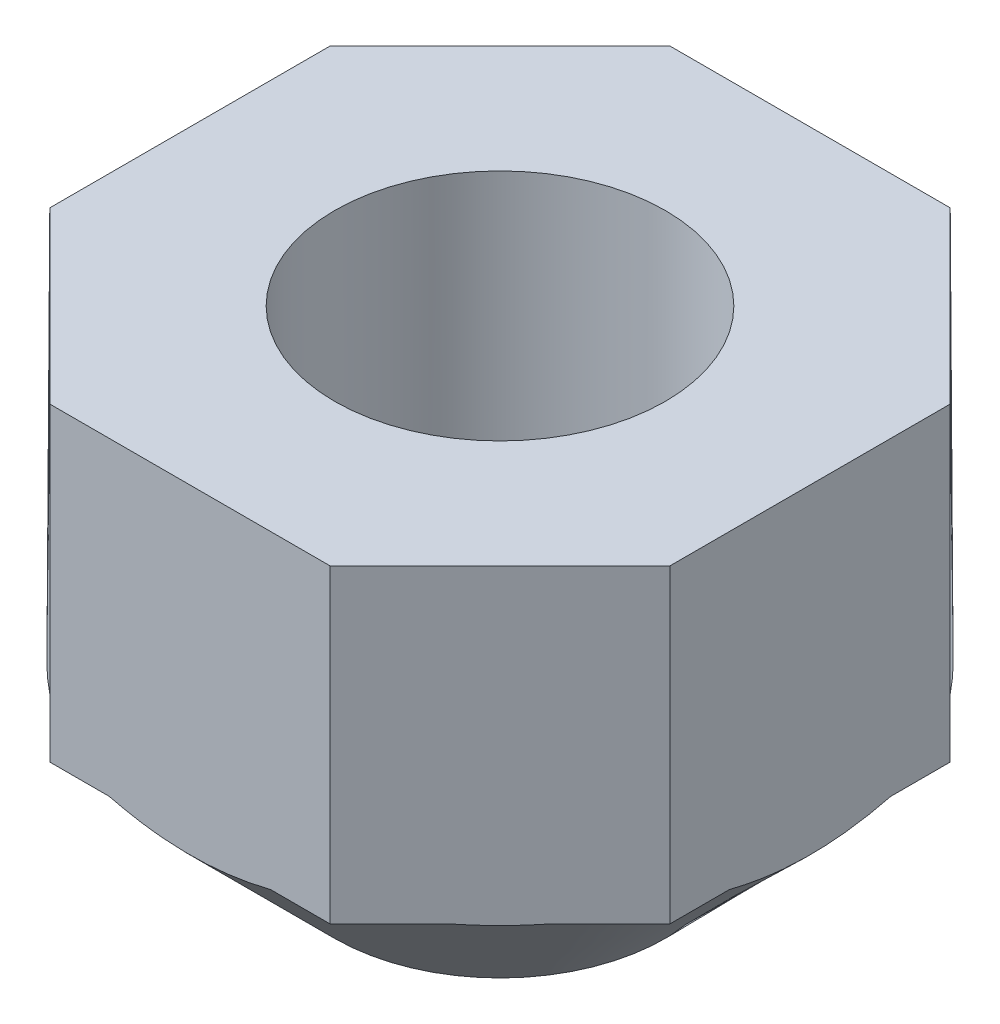
ISO-10303-21;
HEADER;
FILE_DESCRIPTION(('STEP AP214'),'2;1');
FILE_NAME('part.step','',(''),(''),'','','');
FILE_SCHEMA(('AUTOMOTIVE_DESIGN { 1 0 10303 214 1 1 1 1 }'));
ENDSEC;
DATA;
#1=APPLICATION_CONTEXT('core data for automotive mechanical design processes');
#2=APPLICATION_PROTOCOL_DEFINITION('international standard','automotive_design',2000,#1);
#3=PRODUCT_CONTEXT('',#1,'mechanical');
#4=PRODUCT('Part','Part','',(#3));
#5=PRODUCT_RELATED_PRODUCT_CATEGORY('part','',(#4));
#6=PRODUCT_DEFINITION_FORMATION('','',#4);
#7=PRODUCT_DEFINITION_CONTEXT('part definition',#1,'design');
#8=PRODUCT_DEFINITION('design','',#6,#7);
#9=PRODUCT_DEFINITION_SHAPE('','',#8);
#10=(LENGTH_UNIT() NAMED_UNIT(*) SI_UNIT(.MILLI.,.METRE.));
#11=(NAMED_UNIT(*) PLANE_ANGLE_UNIT() SI_UNIT($,.RADIAN.));
#12=(NAMED_UNIT(*) SI_UNIT($,.STERADIAN.) SOLID_ANGLE_UNIT());
#13=UNCERTAINTY_MEASURE_WITH_UNIT(LENGTH_MEASURE(1.E-05),#10,'distance_accuracy_value','');
#14=(GEOMETRIC_REPRESENTATION_CONTEXT(3) GLOBAL_UNCERTAINTY_ASSIGNED_CONTEXT((#13)) GLOBAL_UNIT_ASSIGNED_CONTEXT((#10,
#11,#12)) REPRESENTATION_CONTEXT('',''));
#15=CARTESIAN_POINT('',(0.,0.,0.));
#16=DIRECTION('',(0.,0.,1.));
#17=DIRECTION('',(1.,0.,0.));
#18=AXIS2_PLACEMENT_3D('',#15,#16,#17);
#19=CARTESIAN_POINT('',(4.1106075524833,14.5354910621549,14.8549304515649));
#20=DIRECTION('',(0.,1.,0.));
#21=DIRECTION('',(0.,0.,-1.));
#22=AXIS2_PLACEMENT_3D('',#19,#20,#21);
#23=PLANE('',#22);
#24=DIRECTION('',(0.,0.,-1.));
#25=VECTOR('',#24,1.);
#26=CARTESIAN_POINT('',(2.61060755248329,14.5354910621549,13.3549304515649));
#27=LINE('',#26,#25);
#28=CARTESIAN_POINT('',(2.61060755248329,14.5354910621549,14.4644179677696));
#29=VERTEX_POINT('',#28);
#30=CARTESIAN_POINT('',(2.61060755248329,14.5354910621549,14.1769304515649));
#31=VERTEX_POINT('',#30);
#32=EDGE_CURVE('E317',#29,#31,#27,.T.);
#33=ORIENTED_EDGE('',*,*,#32,.T.);
#34=DIRECTION('',(-0.707106781186546,0.,0.707106781186549));
#35=VECTOR('',#34,1.);
#36=CARTESIAN_POINT('',(3.43260755248329,14.5354910621549,13.3549304515649));
#37=LINE('',#36,#35);
#38=CARTESIAN_POINT('',(2.8977972136582,14.5354910621549,13.88974079039));
#39=VERTEX_POINT('',#38);
#40=EDGE_CURVE('E11',#31,#39,#37,.F.);
#41=ORIENTED_EDGE('',*,*,#40,.T.);
#42=CARTESIAN_POINT('',(4.1106075524833,14.5354910621549,14.8549304515649));
#43=DIRECTION('',(0.,1.,0.));
#44=DIRECTION('',(0.,0.,-1.));
#45=AXIS2_PLACEMENT_3D('',#42,#43,#44);
#46=CIRCLE('',#45,1.54999999999999);
#47=EDGE_CURVE('E276',#29,#39,#46,.F.);
#48=ORIENTED_EDGE('',*,*,#47,.F.);
#49=EDGE_LOOP('',(#33,#41,#48));
#50=FACE_BOUND('',#49,.T.);
#51=ADVANCED_FACE('F44',(#50),#23,.F.);
#52=DIRECTION('',(-1.,0.,0.));
#53=VECTOR('',#52,1.);
#54=CARTESIAN_POINT('',(2.6106075524833,14.5354910621549,16.3549304515649));
#55=LINE('',#54,#53);
#56=CARTESIAN_POINT('',(3.72009506868799,14.5354910621549,16.3549304515649));
#57=VERTEX_POINT('',#56);
#58=CARTESIAN_POINT('',(3.4326075524833,14.5354910621549,16.3549304515649));
#59=VERTEX_POINT('',#58);
#60=EDGE_CURVE('E176',#57,#59,#55,.T.);
#61=ORIENTED_EDGE('',*,*,#60,.T.);
#62=DIRECTION('',(0.70710678118655,0.,0.707106781186545));
#63=VECTOR('',#62,1.);
#64=CARTESIAN_POINT('',(2.6106075524833,14.5354910621549,15.5329304515649));
#65=LINE('',#64,#63);
#66=CARTESIAN_POINT('',(3.1454178913084,14.5354910621549,16.06774079039));
#67=VERTEX_POINT('',#66);
#68=EDGE_CURVE('E281',#59,#67,#65,.F.);
#69=ORIENTED_EDGE('',*,*,#68,.T.);
#70=EDGE_CURVE('E330',#57,#67,#46,.F.);
#71=ORIENTED_EDGE('',*,*,#70,.F.);
#72=EDGE_LOOP('',(#61,#69,#71));
#73=FACE_BOUND('',#72,.T.);
#74=ADVANCED_FACE('F429',(#73),#23,.F.);
#75=DIRECTION('',(0.,0.,1.));
#76=VECTOR('',#75,1.);
#77=CARTESIAN_POINT('',(5.61060755248329,14.5354910621549,13.3549304515649));
#78=LINE('',#77,#76);
#79=CARTESIAN_POINT('',(5.61060755248329,14.5354910621549,15.2454429353602));
#80=VERTEX_POINT('',#79);
#81=CARTESIAN_POINT('',(5.61060755248329,14.5354910621549,15.5329304515649));
#82=VERTEX_POINT('',#81);
#83=EDGE_CURVE('E187',#80,#82,#78,.T.);
#84=ORIENTED_EDGE('',*,*,#83,.T.);
#85=DIRECTION('',(0.707106781186546,0.,-0.707106781186549));
#86=VECTOR('',#85,1.);
#87=CARTESIAN_POINT('',(4.78860755248329,14.5354910621549,16.3549304515649));
#88=LINE('',#87,#86);
#89=CARTESIAN_POINT('',(5.32341789130842,14.5354910621549,15.8201201127398));
#90=VERTEX_POINT('',#89);
#91=EDGE_CURVE('E373',#82,#90,#88,.F.);
#92=ORIENTED_EDGE('',*,*,#91,.T.);
#93=EDGE_CURVE('E325',#80,#90,#46,.F.);
#94=ORIENTED_EDGE('',*,*,#93,.F.);
#95=EDGE_LOOP('',(#84,#92,#94));
#96=FACE_BOUND('',#95,.T.);
#97=ADVANCED_FACE('F424',(#96),#23,.F.);
#98=DIRECTION('',(1.,0.,0.));
#99=VECTOR('',#98,1.);
#100=CARTESIAN_POINT('',(2.61060755248329,14.5354910621549,13.3549304515649));
#101=LINE('',#100,#99);
#102=CARTESIAN_POINT('',(4.50112003627859,14.5354910621549,13.3549304515649));
#103=VERTEX_POINT('',#102);
#104=CARTESIAN_POINT('',(4.78860755248329,14.5354910621549,13.3549304515649));
#105=VERTEX_POINT('',#104);
#106=EDGE_CURVE('E416',#103,#105,#101,.T.);
#107=ORIENTED_EDGE('',*,*,#106,.T.);
#108=DIRECTION('',(-0.70710678118655,0.,-0.707106781186545));
#109=VECTOR('',#108,1.);
#110=CARTESIAN_POINT('',(5.61060755248329,14.5354910621549,14.1769304515649));
#111=LINE('',#110,#109);
#112=CARTESIAN_POINT('',(5.07579721365818,14.5354910621549,13.6421201127398));
#113=VERTEX_POINT('',#112);
#114=EDGE_CURVE('E304',#105,#113,#111,.F.);
#115=ORIENTED_EDGE('',*,*,#114,.T.);
#116=EDGE_CURVE('E305',#103,#113,#46,.F.);
#117=ORIENTED_EDGE('',*,*,#116,.F.);
#118=EDGE_LOOP('',(#107,#115,#117));
#119=FACE_BOUND('',#118,.T.);
#120=ADVANCED_FACE('F422',(#119),#23,.F.);
#121=CARTESIAN_POINT('',(2.8977972136582,14.5354910621549,15.8201201127398));
#122=VERTEX_POINT('',#121);
#123=CARTESIAN_POINT('',(2.6106075524833,14.5354910621549,15.2454429353602));
#124=VERTEX_POINT('',#123);
#125=EDGE_CURVE('E333',#122,#124,#46,.F.);
#126=ORIENTED_EDGE('',*,*,#125,.F.);
#127=DIRECTION('',(0.70710678118655,0.,0.707106781186545));
#128=VECTOR('',#127,1.);
#129=CARTESIAN_POINT('',(2.6106075524833,14.5354910621549,15.5329304515649));
#130=LINE('',#129,#128);
#131=CARTESIAN_POINT('',(2.6106075524833,14.5354910621549,15.5329304515649));
#132=VERTEX_POINT('',#131);
#133=EDGE_CURVE('E283',#122,#132,#130,.F.);
#134=ORIENTED_EDGE('',*,*,#133,.T.);
#135=EDGE_CURVE('E395',#132,#124,#27,.T.);
#136=ORIENTED_EDGE('',*,*,#135,.T.);
#137=EDGE_LOOP('',(#126,#134,#136));
#138=FACE_BOUND('',#137,.T.);
#139=ADVANCED_FACE('F216',(#138),#23,.F.);
#140=CARTESIAN_POINT('',(4.1106075524833,13.7854910621549,14.8549304515649));
#141=DIRECTION('',(0.,1.,0.));
#142=DIRECTION('',(0.,0.,-1.));
#143=AXIS2_PLACEMENT_3D('',#140,#141,#142);
#144=CONICAL_SURFACE('',#143,0.799999999999993,0.785398163397451);
#145=CARTESIAN_POINT('',(5.6106075524833,17.6280202813682,10.4614036733093));
#146=CARTESIAN_POINT('',(5.6106075524833,17.4926398419385,10.6045003015302));
#147=CARTESIAN_POINT('',(5.6106075524833,17.3575803593739,10.7479053671809));
#148=CARTESIAN_POINT('',(5.6106075524833,17.0882965770367,11.0358062621905));
#149=CARTESIAN_POINT('',(5.6106075524833,16.9540734168742,11.1803031566289));
#150=CARTESIAN_POINT('',(5.6106075524833,16.6813278984277,11.4766628944829));
#151=CARTESIAN_POINT('',(5.6106075524833,16.5428633991438,11.6285790796943));
#152=CARTESIAN_POINT('',(5.6106075524833,16.2682153419655,11.9341750521146));
#153=CARTESIAN_POINT('',(5.61060755248329,16.1320294878717,12.0878527634648));
#154=CARTESIAN_POINT('',(5.61060755248329,15.9303481608956,12.3204384871602));
#155=CARTESIAN_POINT('',(5.61060755248329,15.8635986688498,12.3982580625379));
#156=CARTESIAN_POINT('',(5.61060755248329,15.7311796628725,12.554809405688));
#157=CARTESIAN_POINT('',(5.61060755248329,15.6655101201613,12.6335411490561));
#158=CARTESIAN_POINT('',(5.61060755248329,15.5353504888842,12.7924396204392));
#159=CARTESIAN_POINT('',(5.61060755248329,15.4708653513559,12.8726104163956));
#160=CARTESIAN_POINT('',(5.61060755248329,15.3438087838386,13.034442012028));
#161=CARTESIAN_POINT('',(5.61060755248329,15.2812370625692,13.1161025818626));
#162=CARTESIAN_POINT('',(5.61060755248329,15.1599445118837,13.2797450224846));
#163=CARTESIAN_POINT('',(5.61060755248329,15.101171865521,13.3616882573325));
#164=CARTESIAN_POINT('',(5.61060755248329,14.9871731162973,13.5281235476689));
#165=CARTESIAN_POINT('',(5.61060755248329,14.9319496436833,13.6126174267826));
#166=CARTESIAN_POINT('',(5.61060755248329,14.8271029947178,13.7843495655442));
#167=CARTESIAN_POINT('',(5.61060755248329,14.7774481052817,13.8715682414555));
#168=CARTESIAN_POINT('',(5.61060755248329,14.6860824325391,14.0500268925346));
#169=CARTESIAN_POINT('',(5.61060755248329,14.6443568311206,14.1412589664811));
#170=CARTESIAN_POINT('',(5.61060755248329,14.5917497249704,14.2789747809435));
#171=CARTESIAN_POINT('',(5.61060755248329,14.5762086383317,14.3236763183838));
#172=CARTESIAN_POINT('',(5.61060755248329,14.5483350439821,14.4140989366191));
#173=CARTESIAN_POINT('',(5.61060755248329,14.53600355009,14.4598203346197));
#174=CARTESIAN_POINT('',(5.61060755248329,14.5151471650468,14.5518725128924));
#175=CARTESIAN_POINT('',(5.61060755248329,14.5066018714269,14.5981986071237));
#176=CARTESIAN_POINT('',(5.61060755248329,14.4936703696076,14.6914259192168));
#177=CARTESIAN_POINT('',(5.61060755248329,14.4892831476809,14.7383269940739));
#178=CARTESIAN_POINT('',(5.61060755248329,14.4849108595526,14.832675299252));
#179=CARTESIAN_POINT('',(5.61060755248329,14.4849576076465,14.8801240336572));
#180=CARTESIAN_POINT('',(5.61060755248329,14.4895297435146,14.9748011578357));
#181=CARTESIAN_POINT('',(5.61060755248329,14.4940551516903,15.0220295466042));
#182=CARTESIAN_POINT('',(5.61060755248329,14.5073408514048,15.1160933502332));
#183=CARTESIAN_POINT('',(5.61060755248329,14.5161200185423,15.1629260578166));
#184=CARTESIAN_POINT('',(5.61060755248329,14.5374567969059,15.2557296198063));
#185=CARTESIAN_POINT('',(5.61060755248329,14.5500161571331,15.3017000647837));
#186=CARTESIAN_POINT('',(5.61060755248329,14.5866408518226,15.4191679551375));
#187=CARTESIAN_POINT('',(5.61060755248329,14.6131432676126,15.4899039179689));
#188=CARTESIAN_POINT('',(5.61060755248329,14.6721780991618,15.6288021293198));
#189=CARTESIAN_POINT('',(5.61060755248329,14.7047154260604,15.6969622268573));
#190=CARTESIAN_POINT('',(5.61060755248329,14.7745088897932,15.8316244824446));
#191=CARTESIAN_POINT('',(5.61060755248329,14.8118071781733,15.8981045514904));
#192=CARTESIAN_POINT('',(5.61060755248329,14.8701949769088,15.9963321630876));
#193=CARTESIAN_POINT('',(5.61060755248329,14.8900605389022,16.0288202831524));
#194=CARTESIAN_POINT('',(5.61060755248329,14.9304992310945,16.0933523848002));
#195=CARTESIAN_POINT('',(5.61060755248329,14.9510723389893,16.1253963803389));
#196=CARTESIAN_POINT('',(5.61060755248329,15.0209710351577,16.2320207639462));
#197=CARTESIAN_POINT('',(5.61060755248329,15.0716660133577,16.3057039451728));
#198=CARTESIAN_POINT('',(5.61060755248329,15.1754647042348,16.451360067471));
#199=CARTESIAN_POINT('',(5.61060755248329,15.2285689462043,16.5233326273911));
#200=CARTESIAN_POINT('',(5.61060755248329,15.3365970287036,16.6659715148448));
#201=CARTESIAN_POINT('',(5.61060755248329,15.3915220802745,16.7366369222506));
#202=CARTESIAN_POINT('',(5.61060755248329,15.5027329270428,16.8768909595132));
#203=CARTESIAN_POINT('',(5.61060755248329,15.5590187993383,16.946479527993));
#204=CARTESIAN_POINT('',(5.61060755248329,15.7298006424666,17.1543968325011));
#205=CARTESIAN_POINT('',(5.61060755248329,15.8458741412015,17.2914280809833));
#206=CARTESIAN_POINT('',(5.61060755248329,16.0806097609979,17.563138981572));
#207=CARTESIAN_POINT('',(5.61060755248329,16.1992708189907,17.6978195599543));
#208=CARTESIAN_POINT('',(5.61060755248329,16.426250363482,17.9519848872911));
#209=CARTESIAN_POINT('',(5.61060755248329,16.5343959556598,18.0716243325645));
#210=CARTESIAN_POINT('',(5.61060755248329,16.7517593563051,18.3099499011857));
#211=CARTESIAN_POINT('',(5.61060755248329,16.8609772929806,18.42863590738));
#212=CARTESIAN_POINT('',(5.61060755248329,17.0795000779517,18.6645070902033));
#213=CARTESIAN_POINT('',(5.61060755248329,17.1887998141319,18.7816970093878));
#214=CARTESIAN_POINT('',(5.61060755248329,17.4079985525779,19.0154814876889));
#215=CARTESIAN_POINT('',(5.61060755248329,17.5178974601839,19.1320761355178));
#216=CARTESIAN_POINT('',(5.61060755248329,17.6280202813682,19.2484572298205));
#217=B_SPLINE_CURVE_WITH_KNOTS('',3,(#145,#146,#147,#148,#149,#150,#151,#152,#153,#154,#155,
#156,#157,#158,#159,#160,#161,#162,#163,#164,#165,#166,#167,#168,#169,#170,#171,#172,#173,#174,
#175,#176,#177,#178,#179,#180,#181,#182,#183,#184,#185,#186,#187,#188,#189,#190,#191,#192,#193,
#194,#195,#196,#197,#198,#199,#200,#201,#202,#203,#204,#205,#206,#207,#208,#209,#210,#211,#212,
#213,#214,#215,#216),.UNSPECIFIED.,.F.,.F.,(4,2,2,2,2,2,2,2,2,2,2,2,2,2,2,2,2,2,2,2,2,2,2,2,2,2,
2,2,2,2,2,2,2,2,2,4),(0.,0.590970707000365,1.18262130555722,1.79926102370109,2.41523654793279,
2.72280443360226,3.03036410950729,3.33900371324903,3.64759609634427,3.95005582160727,
4.25273717098973,4.55359634051077,4.85388761837179,4.99576910072231,5.13769534514818,
5.27884721187092,5.41996465727041,5.5620947142452,5.70422541866527,5.84699267033496,
5.98982607865929,6.21602728897291,6.44241339331488,6.67096449078112,6.78519924733086,
6.89943040611199,7.16766858442484,7.43596598023382,7.70444555258287,7.97294037161215,
8.51163120922227,9.05010475307566,9.53391581184819,10.0177854363007,10.4985315806777,
10.979203856715),.UNSPECIFIED.);
#218=CARTESIAN_POINT('',(5.61060755248329,14.5354910621549,14.4644179677696));
#219=VERTEX_POINT('',#218);
#220=EDGE_CURVE('E168',#219,#80,#217,.T.);
#221=ORIENTED_EDGE('',*,*,#220,.T.);
#222=ORIENTED_EDGE('',*,*,#93,.T.);
#223=CARTESIAN_POINT('',(4.1106075524833,14.5354910621549,14.8549304515649));
#224=DIRECTION('',(0.,-1.,0.));
#225=DIRECTION('',(0.782458283112986,0.,0.6227030072096));
#226=AXIS2_PLACEMENT_3D('',#223,#224,#225);
#227=CIRCLE('',#226,1.54999999999999);
#228=CARTESIAN_POINT('',(5.07579721365817,14.5354910621549,16.06774079039));
#229=VERTEX_POINT('',#228);
#230=EDGE_CURVE('E309',#90,#229,#227,.T.);
#231=ORIENTED_EDGE('',*,*,#230,.T.);
#232=CARTESIAN_POINT('',(4.5011200362786,14.5354910621549,16.3549304515649));
#233=VERTEX_POINT('',#232);
#234=EDGE_CURVE('E306',#229,#233,#46,.F.);
#235=ORIENTED_EDGE('',*,*,#234,.T.);
#236=CARTESIAN_POINT('',(8.50413433073887,17.6280202813682,16.3549304515649));
#237=CARTESIAN_POINT('',(8.36103770251803,17.4926398419385,16.3549304515649));
#238=CARTESIAN_POINT('',(8.21763263686735,17.3575803593739,16.3549304515649));
#239=CARTESIAN_POINT('',(7.92973174185773,17.0882965770367,16.3549304515649));
#240=CARTESIAN_POINT('',(7.78523484741935,16.9540734168742,16.3549304515649));
#241=CARTESIAN_POINT('',(7.48887510956535,16.6813278984277,16.3549304515649));
#242=CARTESIAN_POINT('',(7.33695892435388,16.5428633991438,16.3549304515649));
#243=CARTESIAN_POINT('',(7.03136295193359,16.2682153419655,16.3549304515649));
#244=CARTESIAN_POINT('',(6.87768524058343,16.1320294878717,16.3549304515649));
#245=CARTESIAN_POINT('',(6.64509951688798,15.9303481608956,16.3549304515649));
#246=CARTESIAN_POINT('',(6.56727994151029,15.8635986688498,16.3549304515649));
#247=CARTESIAN_POINT('',(6.41072859836026,15.7311796628725,16.3549304515649));
#248=CARTESIAN_POINT('',(6.33199685499209,15.6655101201613,16.3549304515649));
#249=CARTESIAN_POINT('',(6.173098383609,15.5353504888842,16.3549304515649));
#250=CARTESIAN_POINT('',(6.0929275876526,15.4708653513559,16.3549304515649));
#251=CARTESIAN_POINT('',(5.93109599202021,15.3438087838386,16.3549304515649));
#252=CARTESIAN_POINT('',(5.84943542218557,15.2812370625692,16.3549304515649));
#253=CARTESIAN_POINT('',(5.68579298156362,15.1599445118837,16.3549304515649));
#254=CARTESIAN_POINT('',(5.60384974671571,15.101171865521,16.3549304515649));
#255=CARTESIAN_POINT('',(5.43741445637927,14.9871731162972,16.3549304515649));
#256=CARTESIAN_POINT('',(5.35292057726563,14.9319496436833,16.3549304515649));
#257=CARTESIAN_POINT('',(5.18118843850398,14.8271029947178,16.3549304515649));
#258=CARTESIAN_POINT('',(5.09396976259274,14.7774481052817,16.3549304515649));
#259=CARTESIAN_POINT('',(4.91551111151362,14.6860824325391,16.3549304515649));
#260=CARTESIAN_POINT('',(4.82427903756714,14.6443568311206,16.3549304515649));
#261=CARTESIAN_POINT('',(4.68656322310467,14.5917497249704,16.3549304515649));
#262=CARTESIAN_POINT('',(4.64186168566438,14.5762086383317,16.3549304515649));
#263=CARTESIAN_POINT('',(4.55143906742911,14.5483350439821,16.3549304515649));
#264=CARTESIAN_POINT('',(4.50571766942852,14.53600355009,16.3549304515649));
#265=CARTESIAN_POINT('',(4.41366549115578,14.5151471650468,16.3549304515649));
#266=CARTESIAN_POINT('',(4.36733939692451,14.5066018714269,16.3549304515649));
#267=CARTESIAN_POINT('',(4.27411208483142,14.4936703696076,16.3549304515649));
#268=CARTESIAN_POINT('',(4.22721100997429,14.4892831476809,16.3549304515649));
#269=CARTESIAN_POINT('',(4.13286270479626,14.4849108595526,16.3549304515649));
#270=CARTESIAN_POINT('',(4.08541397039101,14.4849576076465,16.3549304515649));
#271=CARTESIAN_POINT('',(3.99073684621254,14.4895297435146,16.3549304515649));
#272=CARTESIAN_POINT('',(3.94350845744405,14.4940551516903,16.3549304515649));
#273=CARTESIAN_POINT('',(3.84944465381501,14.5073408514048,16.3549304515649));
#274=CARTESIAN_POINT('',(3.8026119462316,14.5161200185423,16.3549304515649));
#275=CARTESIAN_POINT('',(3.70980838424192,14.5374567969059,16.3549304515649));
#276=CARTESIAN_POINT('',(3.66383793926452,14.5500161571331,16.3549304515649));
#277=CARTESIAN_POINT('',(3.54637004891076,14.5866408518226,16.3549304515649));
#278=CARTESIAN_POINT('',(3.47563408607933,14.6131432676126,16.3549304515649));
#279=CARTESIAN_POINT('',(3.33673587472839,14.6721780991618,16.3549304515649));
#280=CARTESIAN_POINT('',(3.26857577719088,14.7047154260604,16.3549304515649));
#281=CARTESIAN_POINT('',(3.13391352160365,14.7745088897932,16.3549304515649));
#282=CARTESIAN_POINT('',(3.06743345255787,14.8118071781733,16.3549304515649));
#283=CARTESIAN_POINT('',(2.96920584096058,14.8701949769088,16.3549304515649));
#284=CARTESIAN_POINT('',(2.93671772089582,14.8900605389022,16.3549304515649));
#285=CARTESIAN_POINT('',(2.87218561924805,14.9304992310945,16.3549304515649));
#286=CARTESIAN_POINT('',(2.84014162370933,14.9510723389893,16.3549304515649));
#287=CARTESIAN_POINT('',(2.73351724010206,15.0209710351577,16.3549304515649));
#288=CARTESIAN_POINT('',(2.65983405887546,15.0716660133577,16.3549304515649));
#289=CARTESIAN_POINT('',(2.51417793657718,15.1754647042348,16.3549304515649));
#290=CARTESIAN_POINT('',(2.44220537665709,15.2285689462044,16.3549304515649));
#291=CARTESIAN_POINT('',(2.29956648920346,15.3365970287036,16.3549304515649));
#292=CARTESIAN_POINT('',(2.22890108179766,15.3915220802745,16.3549304515649));
#293=CARTESIAN_POINT('',(2.08864704453503,15.5027329270428,16.3549304515649));
#294=CARTESIAN_POINT('',(2.0190584760552,15.5590187993383,16.3549304515649));
#295=CARTESIAN_POINT('',(1.81114117154715,15.7298006424666,16.3549304515649));
#296=CARTESIAN_POINT('',(1.67410992306489,15.8458741412015,16.3549304515649));
#297=CARTESIAN_POINT('',(1.4023990224762,16.0806097609979,16.3549304515649));
#298=CARTESIAN_POINT('',(1.26771844409388,16.1992708189907,16.3549304515649));
#299=CARTESIAN_POINT('',(1.01355311675715,16.426250363482,16.3549304515649));
#300=CARTESIAN_POINT('',(0.893913671483689,16.5343959556598,16.3549304515649));
#301=CARTESIAN_POINT('',(0.655588102862512,16.7517593563051,16.3549304515649));
#302=CARTESIAN_POINT('',(0.536902096668215,16.8609772929806,16.3549304515649));
#303=CARTESIAN_POINT('',(0.301030913844878,17.0795000779517,16.3549304515649));
#304=CARTESIAN_POINT('',(0.183840994660384,17.1887998141319,16.3549304515649));
#305=CARTESIAN_POINT('',(-0.0499434836406328,17.4079985525779,16.3549304515649));
#306=CARTESIAN_POINT('',(-0.166538131469544,17.5178974601839,16.3549304515649));
#307=CARTESIAN_POINT('',(-0.28291922577228,17.6280202813682,16.3549304515649));
#308=B_SPLINE_CURVE_WITH_KNOTS('',3,(#236,#237,#238,#239,#240,#241,#242,#243,#244,#245,#246,
#247,#248,#249,#250,#251,#252,#253,#254,#255,#256,#257,#258,#259,#260,#261,#262,#263,#264,#265,
#266,#267,#268,#269,#270,#271,#272,#273,#274,#275,#276,#277,#278,#279,#280,#281,#282,#283,#284,
#285,#286,#287,#288,#289,#290,#291,#292,#293,#294,#295,#296,#297,#298,#299,#300,#301,#302,#303,
#304,#305,#306,#307),.UNSPECIFIED.,.F.,.F.,(4,2,2,2,2,2,2,2,2,2,2,2,2,2,2,2,2,2,2,2,2,2,2,2,2,2,
2,2,2,2,2,2,2,2,2,4),(0.,0.590970707000365,1.18262130555723,1.79926102370109,2.4152365479328,
2.72280443360227,3.0303641095073,3.33900371324904,3.64759609634428,3.95005582160729,
4.25273717098975,4.55359634051078,4.8538876183718,4.99576910072232,5.13769534514819,
5.27884721187092,5.41996465727041,5.56209471424521,5.70422541866527,5.84699267033496,
5.98982607865929,6.21602728897291,6.44241339331489,6.67096449078113,6.78519924733087,
6.899430406112,7.16766858442484,7.43596598023382,7.70444555258288,7.97294037161216,
8.51163120922228,9.05010475307567,9.53391581184819,10.0177854363007,10.4985315806777,
10.979203856715),.UNSPECIFIED.);
#309=EDGE_CURVE('E224',#233,#57,#308,.T.);
#310=ORIENTED_EDGE('',*,*,#309,.T.);
#311=ORIENTED_EDGE('',*,*,#70,.T.);
#312=CARTESIAN_POINT('',(4.1106075524833,14.5354910621549,14.8549304515649));
#313=DIRECTION('',(0.,-1.,0.));
#314=DIRECTION('',(-0.622703007209615,0.,0.782458283112974));
#315=AXIS2_PLACEMENT_3D('',#312,#313,#314);
#316=CIRCLE('',#315,1.54999999999999);
#317=EDGE_CURVE('E335',#67,#122,#316,.T.);
#318=ORIENTED_EDGE('',*,*,#317,.T.);
#319=ORIENTED_EDGE('',*,*,#125,.T.);
#320=CARTESIAN_POINT('',(2.6106075524833,17.6280202813682,19.2484572298205));
#321=CARTESIAN_POINT('',(2.6106075524833,17.4926398419385,19.1053606015997));
#322=CARTESIAN_POINT('',(2.6106075524833,17.3575803593739,18.961955535949));
#323=CARTESIAN_POINT('',(2.6106075524833,17.0882965770367,18.6740546409394));
#324=CARTESIAN_POINT('',(2.6106075524833,16.9540734168742,18.529557746501));
#325=CARTESIAN_POINT('',(2.6106075524833,16.6813278984277,18.233198008647));
#326=CARTESIAN_POINT('',(2.6106075524833,16.5428633991438,18.0812818234355));
#327=CARTESIAN_POINT('',(2.6106075524833,16.2682153419655,17.7756858510152));
#328=CARTESIAN_POINT('',(2.6106075524833,16.1320294878717,17.6220081396651));
#329=CARTESIAN_POINT('',(2.6106075524833,15.9303481608956,17.3894224159696));
#330=CARTESIAN_POINT('',(2.6106075524833,15.8635986688498,17.3116028405919));
#331=CARTESIAN_POINT('',(2.6106075524833,15.7311796628725,17.1550514974419));
#332=CARTESIAN_POINT('',(2.6106075524833,15.6655101201613,17.0763197540737));
#333=CARTESIAN_POINT('',(2.6106075524833,15.5353504888842,16.9174212826906));
#334=CARTESIAN_POINT('',(2.6106075524833,15.4708653513559,16.8372504867342));
#335=CARTESIAN_POINT('',(2.6106075524833,15.3438087838386,16.6754188911018));
#336=CARTESIAN_POINT('',(2.6106075524833,15.2812370625692,16.5937583212672));
#337=CARTESIAN_POINT('',(2.6106075524833,15.1599445118837,16.4301158806453));
#338=CARTESIAN_POINT('',(2.6106075524833,15.101171865521,16.3481726457973));
#339=CARTESIAN_POINT('',(2.6106075524833,14.9871731162973,16.1817373554609));
#340=CARTESIAN_POINT('',(2.6106075524833,14.9319496436833,16.0972434763473));
#341=CARTESIAN_POINT('',(2.6106075524833,14.8271029947178,15.9255113375856));
#342=CARTESIAN_POINT('',(2.6106075524833,14.7774481052817,15.8382926616744));
#343=CARTESIAN_POINT('',(2.6106075524833,14.6860824325391,15.6598340105953));
#344=CARTESIAN_POINT('',(2.6106075524833,14.6443568311206,15.5686019366488));
#345=CARTESIAN_POINT('',(2.6106075524833,14.5917497249704,15.4308861221863));
#346=CARTESIAN_POINT('',(2.6106075524833,14.5762086383317,15.386184584746));
#347=CARTESIAN_POINT('',(2.6106075524833,14.5483350439821,15.2957619665108));
#348=CARTESIAN_POINT('',(2.6106075524833,14.53600355009,15.2500405685102));
#349=CARTESIAN_POINT('',(2.6106075524833,14.5151471650468,15.1579883902374));
#350=CARTESIAN_POINT('',(2.6106075524833,14.5066018714269,15.1116622960061));
#351=CARTESIAN_POINT('',(2.6106075524833,14.4936703696076,15.0184349839131));
#352=CARTESIAN_POINT('',(2.6106075524833,14.4892831476809,14.9715339090559));
#353=CARTESIAN_POINT('',(2.6106075524833,14.4849108595526,14.8771856038779));
#354=CARTESIAN_POINT('',(2.61060755248329,14.4849576076466,14.8297368694726));
#355=CARTESIAN_POINT('',(2.61060755248329,14.4895297435146,14.7350597452942));
#356=CARTESIAN_POINT('',(2.61060755248329,14.4940551516903,14.6878313565257));
#357=CARTESIAN_POINT('',(2.61060755248329,14.5073408514048,14.5937675528966));
#358=CARTESIAN_POINT('',(2.61060755248329,14.5161200185423,14.5469348453132));
#359=CARTESIAN_POINT('',(2.61060755248329,14.5374567969059,14.4541312833236));
#360=CARTESIAN_POINT('',(2.61060755248329,14.5500161571331,14.4081608383462));
#361=CARTESIAN_POINT('',(2.61060755248329,14.5866408518226,14.2906929479924));
#362=CARTESIAN_POINT('',(2.61060755248329,14.6131432676126,14.219956985161));
#363=CARTESIAN_POINT('',(2.61060755248329,14.6721780991618,14.08105877381));
#364=CARTESIAN_POINT('',(2.61060755248329,14.7047154260604,14.0128986762725));
#365=CARTESIAN_POINT('',(2.61060755248329,14.7745088897932,13.8782364206853));
#366=CARTESIAN_POINT('',(2.61060755248329,14.8118071781733,13.8117563516395));
#367=CARTESIAN_POINT('',(2.61060755248329,14.8701949769088,13.7135287400422));
#368=CARTESIAN_POINT('',(2.61060755248329,14.8900605389022,13.6810406199775));
#369=CARTESIAN_POINT('',(2.61060755248329,14.9304992310945,13.6165085183297));
#370=CARTESIAN_POINT('',(2.61060755248329,14.9510723389893,13.584464522791));
#371=CARTESIAN_POINT('',(2.61060755248329,15.0209710351577,13.4778401391837));
#372=CARTESIAN_POINT('',(2.61060755248329,15.0716660133577,13.4041569579571));
#373=CARTESIAN_POINT('',(2.61060755248329,15.1754647042348,13.2585008356588));
#374=CARTESIAN_POINT('',(2.61060755248329,15.2285689462044,13.1865282757387));
#375=CARTESIAN_POINT('',(2.61060755248329,15.3365970287036,13.0438893882851));
#376=CARTESIAN_POINT('',(2.61060755248329,15.3915220802745,12.9732239808793));
#377=CARTESIAN_POINT('',(2.61060755248329,15.5027329270428,12.8329699436167));
#378=CARTESIAN_POINT('',(2.61060755248329,15.5590187993383,12.7633813751368));
#379=CARTESIAN_POINT('',(2.61060755248329,15.7298006424666,12.5554640706288));
#380=CARTESIAN_POINT('',(2.61060755248329,15.8458741412015,12.4184328221465));
#381=CARTESIAN_POINT('',(2.61060755248329,16.0806097609979,12.1467219215578));
#382=CARTESIAN_POINT('',(2.61060755248329,16.1992708189907,12.0120413431755));
#383=CARTESIAN_POINT('',(2.61060755248329,16.426250363482,11.7578760158388));
#384=CARTESIAN_POINT('',(2.61060755248329,16.5343959556598,11.6382365705653));
#385=CARTESIAN_POINT('',(2.61060755248329,16.7517593563051,11.3999110019441));
#386=CARTESIAN_POINT('',(2.61060755248329,16.8609772929806,11.2812249957498));
#387=CARTESIAN_POINT('',(2.61060755248329,17.0795000779517,11.0453538129265));
#388=CARTESIAN_POINT('',(2.61060755248329,17.1887998141319,10.928163893742));
#389=CARTESIAN_POINT('',(2.61060755248329,17.4079985525779,10.694379415441));
#390=CARTESIAN_POINT('',(2.61060755248329,17.5178974601839,10.5777847676121));
#391=CARTESIAN_POINT('',(2.61060755248329,17.6280202813682,10.4614036733094));
#392=B_SPLINE_CURVE_WITH_KNOTS('',3,(#320,#321,#322,#323,#324,#325,#326,#327,#328,#329,#330,
#331,#332,#333,#334,#335,#336,#337,#338,#339,#340,#341,#342,#343,#344,#345,#346,#347,#348,#349,
#350,#351,#352,#353,#354,#355,#356,#357,#358,#359,#360,#361,#362,#363,#364,#365,#366,#367,#368,
#369,#370,#371,#372,#373,#374,#375,#376,#377,#378,#379,#380,#381,#382,#383,#384,#385,#386,#387,
#388,#389,#390,#391),.UNSPECIFIED.,.F.,.F.,(4,2,2,2,2,2,2,2,2,2,2,2,2,2,2,2,2,2,2,2,2,2,2,2,2,2,
2,2,2,2,2,2,2,2,2,4),(0.,0.59097070700036,1.18262130555722,1.79926102370109,2.41523654793279,
2.72280443360226,3.03036410950728,3.33900371324902,3.64759609634426,3.95005582160727,
4.25273717098973,4.55359634051076,4.85388761837178,4.9957691007223,5.13769534514817,
5.2788472118709,5.4199646572704,5.56209471424519,5.70422541866526,5.84699267033495,
5.98982607865928,6.2160272889729,6.44241339331487,6.67096449078111,6.78519924733085,
6.89943040611198,7.16766858442482,7.4359659802338,7.70444555258286,7.97294037161214,
8.51163120922227,9.05010475307565,9.53391581184818,10.0177854363007,10.4985315806777,
10.979203856715),.UNSPECIFIED.);
#393=EDGE_CURVE('E233',#124,#29,#392,.T.);
#394=ORIENTED_EDGE('',*,*,#393,.T.);
#395=ORIENTED_EDGE('',*,*,#47,.T.);
#396=CARTESIAN_POINT('',(4.1106075524833,14.5354910621549,14.8549304515649));
#397=DIRECTION('',(0.,-1.,0.));
#398=DIRECTION('',(-0.78245828311297,0.,-0.62270300720962));
#399=AXIS2_PLACEMENT_3D('',#396,#397,#398);
#400=CIRCLE('',#399,1.54999999999999);
#401=CARTESIAN_POINT('',(3.14541789130839,14.5354910621549,13.6421201127398));
#402=VERTEX_POINT('',#401);
#403=EDGE_CURVE('E268',#39,#402,#400,.T.);
#404=ORIENTED_EDGE('',*,*,#403,.T.);
#405=CARTESIAN_POINT('',(3.720095068688,14.5354910621549,13.3549304515649));
#406=VERTEX_POINT('',#405);
#407=EDGE_CURVE('E65',#402,#406,#46,.F.);
#408=ORIENTED_EDGE('',*,*,#407,.T.);
#409=CARTESIAN_POINT('',(-0.282919225772278,17.6280202813682,13.3549304515649));
#410=CARTESIAN_POINT('',(-0.139822597551441,17.4926398419385,13.3549304515649));
#411=CARTESIAN_POINT('',(0.00358246809924103,17.3575803593739,13.3549304515649));
#412=CARTESIAN_POINT('',(0.291483363108863,17.0882965770367,13.3549304515649));
#413=CARTESIAN_POINT('',(0.43598025754724,16.9540734168742,13.3549304515649));
#414=CARTESIAN_POINT('',(0.732339995401238,16.6813278984277,13.3549304515649));
#415=CARTESIAN_POINT('',(0.884256180612711,16.5428633991438,13.3549304515649));
#416=CARTESIAN_POINT('',(1.18985215303299,16.2682153419655,13.3549304515649));
#417=CARTESIAN_POINT('',(1.34352986438316,16.1320294878717,13.3549304515649));
#418=CARTESIAN_POINT('',(1.5761155880786,15.9303481608956,13.3549304515649));
#419=CARTESIAN_POINT('',(1.6539351634563,15.8635986688498,13.3549304515649));
#420=CARTESIAN_POINT('',(1.81048650660633,15.7311796628725,13.3549304515649));
#421=CARTESIAN_POINT('',(1.8892182499745,15.6655101201613,13.3549304515649));
#422=CARTESIAN_POINT('',(2.04811672135759,15.5353504888842,13.3549304515649));
#423=CARTESIAN_POINT('',(2.12828751731399,15.4708653513559,13.3549304515649));
#424=CARTESIAN_POINT('',(2.29011911294637,15.3438087838386,13.3549304515649));
#425=CARTESIAN_POINT('',(2.37177968278102,15.2812370625692,13.3549304515649));
#426=CARTESIAN_POINT('',(2.53542212340297,15.1599445118837,13.3549304515649));
#427=CARTESIAN_POINT('',(2.61736535825087,15.101171865521,13.3549304515649));
#428=CARTESIAN_POINT('',(2.78380064858732,14.9871731162973,13.3549304515649));
#429=CARTESIAN_POINT('',(2.86829452770096,14.9319496436833,13.3549304515649));
#430=CARTESIAN_POINT('',(3.04002666646261,14.8271029947178,13.3549304515649));
#431=CARTESIAN_POINT('',(3.12724534237385,14.7774481052817,13.3549304515649));
#432=CARTESIAN_POINT('',(3.30570399345296,14.6860824325391,13.3549304515649));
#433=CARTESIAN_POINT('',(3.39693606739944,14.6443568311206,13.3549304515649));
#434=CARTESIAN_POINT('',(3.53465188186191,14.5917497249704,13.3549304515649));
#435=CARTESIAN_POINT('',(3.5793534193022,14.5762086383317,13.3549304515649));
#436=CARTESIAN_POINT('',(3.66977603753747,14.5483350439821,13.3549304515649));
#437=CARTESIAN_POINT('',(3.71549743553807,14.53600355009,13.3549304515649));
#438=CARTESIAN_POINT('',(3.8075496138108,14.5151471650468,13.3549304515649));
#439=CARTESIAN_POINT('',(3.85387570804208,14.5066018714269,13.3549304515649));
#440=CARTESIAN_POINT('',(3.94710302013516,14.4936703696076,13.3549304515649));
#441=CARTESIAN_POINT('',(3.9940040949923,14.4892831476809,13.3549304515649));
#442=CARTESIAN_POINT('',(4.08835240017033,14.4849108595526,13.3549304515649));
#443=CARTESIAN_POINT('',(4.13580113457558,14.4849576076466,13.3549304515649));
#444=CARTESIAN_POINT('',(4.23047825875404,14.4895297435146,13.3549304515649));
#445=CARTESIAN_POINT('',(4.27770664752254,14.4940551516903,13.3549304515649));
#446=CARTESIAN_POINT('',(4.37177045115158,14.5073408514048,13.3549304515649));
#447=CARTESIAN_POINT('',(4.41860315873499,14.5161200185423,13.3549304515649));
#448=CARTESIAN_POINT('',(4.51140672072467,14.5374567969059,13.3549304515649));
#449=CARTESIAN_POINT('',(4.55737716570206,14.5500161571331,13.3549304515649));
#450=CARTESIAN_POINT('',(4.67484505605583,14.5866408518226,13.3549304515649));
#451=CARTESIAN_POINT('',(4.74558101888725,14.6131432676126,13.3549304515649));
#452=CARTESIAN_POINT('',(4.8844792302382,14.6721780991618,13.3549304515649));
#453=CARTESIAN_POINT('',(4.9526393277757,14.7047154260604,13.3549304515649));
#454=CARTESIAN_POINT('',(5.08730158336294,14.7745088897932,13.3549304515649));
#455=CARTESIAN_POINT('',(5.15378165240872,14.8118071781733,13.3549304515649));
#456=CARTESIAN_POINT('',(5.252009264006,14.8701949769088,13.3549304515649));
#457=CARTESIAN_POINT('',(5.28449738407076,14.8900605389022,13.3549304515649));
#458=CARTESIAN_POINT('',(5.34902948571854,14.9304992310945,13.3549304515649));
#459=CARTESIAN_POINT('',(5.38107348125725,14.9510723389893,13.3549304515649));
#460=CARTESIAN_POINT('',(5.48769786486453,15.0209710351577,13.3549304515649));
#461=CARTESIAN_POINT('',(5.56138104609112,15.0716660133577,13.3549304515649));
#462=CARTESIAN_POINT('',(5.7070371683894,15.1754647042348,13.3549304515649));
#463=CARTESIAN_POINT('',(5.77900972830949,15.2285689462043,13.3549304515649));
#464=CARTESIAN_POINT('',(5.92164861576313,15.3365970287036,13.3549304515649));
#465=CARTESIAN_POINT('',(5.99231402316893,15.3915220802745,13.3549304515649));
#466=CARTESIAN_POINT('',(6.13256806043156,15.5027329270428,13.3549304515649));
#467=CARTESIAN_POINT('',(6.20215662891139,15.5590187993383,13.3549304515649));
#468=CARTESIAN_POINT('',(6.41007393341944,15.7298006424666,13.3549304515649));
#469=CARTESIAN_POINT('',(6.5471051819017,15.8458741412015,13.3549304515649));
#470=CARTESIAN_POINT('',(6.81881608249039,16.0806097609979,13.3549304515649));
#471=CARTESIAN_POINT('',(6.95349666087271,16.1992708189907,13.3549304515649));
#472=CARTESIAN_POINT('',(7.20766198820944,16.426250363482,13.3549304515649));
#473=CARTESIAN_POINT('',(7.3273014334829,16.5343959556598,13.3549304515649));
#474=CARTESIAN_POINT('',(7.56562700210408,16.7517593563051,13.3549304515649));
#475=CARTESIAN_POINT('',(7.68431300829837,16.8609772929806,13.3549304515649));
#476=CARTESIAN_POINT('',(7.92018419112171,17.0795000779517,13.3549304515649));
#477=CARTESIAN_POINT('',(8.0373741103062,17.1887998141319,13.3549304515649));
#478=CARTESIAN_POINT('',(8.27115858860722,17.4079985525779,13.3549304515649));
#479=CARTESIAN_POINT('',(8.38775323643613,17.5178974601839,13.3549304515649));
#480=CARTESIAN_POINT('',(8.50413433073887,17.6280202813682,13.3549304515649));
#481=B_SPLINE_CURVE_WITH_KNOTS('',3,(#409,#410,#411,#412,#413,#414,#415,#416,#417,#418,#419,
#420,#421,#422,#423,#424,#425,#426,#427,#428,#429,#430,#431,#432,#433,#434,#435,#436,#437,#438,
#439,#440,#441,#442,#443,#444,#445,#446,#447,#448,#449,#450,#451,#452,#453,#454,#455,#456,#457,
#458,#459,#460,#461,#462,#463,#464,#465,#466,#467,#468,#469,#470,#471,#472,#473,#474,#475,#476,
#477,#478,#479,#480),.UNSPECIFIED.,.F.,.F.,(4,2,2,2,2,2,2,2,2,2,2,2,2,2,2,2,2,2,2,2,2,2,2,2,2,2,
2,2,2,2,2,2,2,2,2,4),(0.,0.590970707000364,1.18262130555722,1.79926102370109,2.41523654793279,
2.72280443360226,3.03036410950729,3.33900371324903,3.64759609634427,3.95005582160727,
4.25273717098973,4.55359634051077,4.85388761837179,4.99576910072231,5.13769534514818,
5.27884721187092,5.41996465727041,5.5620947142452,5.70422541866527,5.84699267033496,
5.98982607865929,6.21602728897291,6.44241339331488,6.67096449078112,6.78519924733086,
6.89943040611199,7.16766858442483,7.43596598023381,7.70444555258287,7.97294037161215,
8.51163120922228,9.05010475307566,9.53391581184819,10.0177854363007,10.4985315806777,
10.979203856715),.UNSPECIFIED.);
#482=EDGE_CURVE('E200',#406,#103,#481,.T.);
#483=ORIENTED_EDGE('',*,*,#482,.T.);
#484=ORIENTED_EDGE('',*,*,#116,.T.);
#485=CARTESIAN_POINT('',(4.1106075524833,14.5354910621549,14.8549304515649));
#486=DIRECTION('',(0.,-1.,0.));
#487=DIRECTION('',(0.622703007209608,0.,-0.782458283112979));
#488=AXIS2_PLACEMENT_3D('',#485,#486,#487);
#489=CIRCLE('',#488,1.54999999999999);
#490=CARTESIAN_POINT('',(5.3234178913084,14.5354910621549,13.88974079039));
#491=VERTEX_POINT('',#490);
#492=EDGE_CURVE('E172',#113,#491,#489,.T.);
#493=ORIENTED_EDGE('',*,*,#492,.T.);
#494=EDGE_CURVE('E162',#491,#219,#46,.F.);
#495=ORIENTED_EDGE('',*,*,#494,.T.);
#496=EDGE_LOOP('',(#221,#222,#231,#235,#310,#311,#318,#319,#394,#395,#404,#408,#483,#484,#493,#495));
#497=FACE_BOUND('',#496,.T.);
#498=CARTESIAN_POINT('',(4.1106075524833,13.785491062155,14.8549304515649));
#499=DIRECTION('',(0.,1.,0.));
#500=DIRECTION('',(0.,0.,1.));
#501=AXIS2_PLACEMENT_3D('',#498,#499,#500);
#502=CIRCLE('',#501,0.800000000000001);
#503=CARTESIAN_POINT('',(4.1106075524833,13.785491062155,15.6549304515649));
#504=VERTEX_POINT('',#503);
#505=EDGE_CURVE('E185',#504,#504,#502,.F.);
#506=ORIENTED_EDGE('',*,*,#505,.F.);
#507=EDGE_LOOP('',(#506));
#508=FACE_BOUND('',#507,.T.);
#509=ADVANCED_FACE('F164',(#497,#508),#144,.T.);
#510=ORIENTED_EDGE('',*,*,#234,.F.);
#511=DIRECTION('',(0.707106781186546,0.,-0.707106781186549));
#512=VECTOR('',#511,1.);
#513=CARTESIAN_POINT('',(4.78860755248329,14.5354910621549,16.3549304515649));
#514=LINE('',#513,#512);
#515=CARTESIAN_POINT('',(4.78860755248329,14.5354910621549,16.3549304515649));
#516=VERTEX_POINT('',#515);
#517=EDGE_CURVE('E367',#229,#516,#514,.F.);
#518=ORIENTED_EDGE('',*,*,#517,.T.);
#519=EDGE_CURVE('E409',#516,#233,#55,.T.);
#520=ORIENTED_EDGE('',*,*,#519,.T.);
#521=EDGE_LOOP('',(#510,#518,#520));
#522=FACE_BOUND('',#521,.T.);
#523=ADVANCED_FACE('F215',(#522),#23,.F.);
#524=ORIENTED_EDGE('',*,*,#407,.F.);
#525=DIRECTION('',(-0.707106781186546,0.,0.707106781186549));
#526=VECTOR('',#525,1.);
#527=CARTESIAN_POINT('',(3.43260755248329,14.5354910621549,13.3549304515649));
#528=LINE('',#527,#526);
#529=CARTESIAN_POINT('',(3.43260755248329,14.5354910621549,13.3549304515649));
#530=VERTEX_POINT('',#529);
#531=EDGE_CURVE('E57',#402,#530,#528,.F.);
#532=ORIENTED_EDGE('',*,*,#531,.T.);
#533=EDGE_CURVE('E192',#530,#406,#101,.T.);
#534=ORIENTED_EDGE('',*,*,#533,.T.);
#535=EDGE_LOOP('',(#524,#532,#534));
#536=FACE_BOUND('',#535,.T.);
#537=ADVANCED_FACE('F420',(#536),#23,.F.);
#538=ORIENTED_EDGE('',*,*,#494,.F.);
#539=DIRECTION('',(-0.70710678118655,0.,-0.707106781186545));
#540=VECTOR('',#539,1.);
#541=CARTESIAN_POINT('',(5.61060755248329,14.5354910621549,14.1769304515649));
#542=LINE('',#541,#540);
#543=CARTESIAN_POINT('',(5.61060755248329,14.5354910621549,14.1769304515649));
#544=VERTEX_POINT('',#543);
#545=EDGE_CURVE('E181',#491,#544,#542,.F.);
#546=ORIENTED_EDGE('',*,*,#545,.T.);
#547=EDGE_CURVE('E179',#544,#219,#78,.T.);
#548=ORIENTED_EDGE('',*,*,#547,.T.);
#549=EDGE_LOOP('',(#538,#546,#548));
#550=FACE_BOUND('',#549,.T.);
#551=ADVANCED_FACE('F180',(#550),#23,.F.);
#552=CARTESIAN_POINT('',(2.61060755248329,8.13349106215494,13.3549304515649));
#553=DIRECTION('',(0.,0.,-1.));
#554=DIRECTION('',(-1.,0.,0.));
#555=AXIS2_PLACEMENT_3D('',#552,#553,#554);
#556=PLANE('',#555);
#557=DIRECTION('',(-1.,0.,0.));
#558=VECTOR('',#557,1.);
#559=CARTESIAN_POINT('',(2.61060755248329,16.0354910621549,13.3549304515649));
#560=LINE('',#559,#558);
#561=CARTESIAN_POINT('',(4.78860755248329,16.0354910621549,13.3549304515649));
#562=VERTEX_POINT('',#561);
#563=CARTESIAN_POINT('',(3.43260755248329,16.0354910621549,13.3549304515649));
#564=VERTEX_POINT('',#563);
#565=EDGE_CURVE('E402',#562,#564,#560,.T.);
#566=ORIENTED_EDGE('',*,*,#565,.F.);
#567=DIRECTION('',(0.,-1.,0.));
#568=VECTOR('',#567,1.);
#569=CARTESIAN_POINT('',(4.78860755248329,8.13349106215494,13.3549304515649));
#570=LINE('',#569,#568);
#571=EDGE_CURVE('E312',#562,#105,#570,.T.);
#572=ORIENTED_EDGE('',*,*,#571,.T.);
#573=ORIENTED_EDGE('',*,*,#106,.F.);
#574=ORIENTED_EDGE('',*,*,#482,.F.);
#575=ORIENTED_EDGE('',*,*,#533,.F.);
#576=DIRECTION('',(0.,1.,0.));
#577=VECTOR('',#576,1.);
#578=CARTESIAN_POINT('',(3.43260755248329,8.13349106215494,13.3549304515649));
#579=LINE('',#578,#577);
#580=EDGE_CURVE('E279',#530,#564,#579,.T.);
#581=ORIENTED_EDGE('',*,*,#580,.T.);
#582=EDGE_LOOP('',(#566,#572,#573,#574,#575,#581));
#583=FACE_BOUND('',#582,.T.);
#584=ADVANCED_FACE('F421',(#583),#556,.T.);
#585=CARTESIAN_POINT('',(2.61060755248329,8.13349106215494,13.3549304515649));
#586=DIRECTION('',(-1.,0.,0.));
#587=DIRECTION('',(0.,0.,1.));
#588=AXIS2_PLACEMENT_3D('',#585,#586,#587);
#589=PLANE('',#588);
#590=ORIENTED_EDGE('',*,*,#135,.F.);
#591=DIRECTION('',(0.,1.,0.));
#592=VECTOR('',#591,1.);
#593=CARTESIAN_POINT('',(2.6106075524833,8.13349106215494,15.5329304515649));
#594=LINE('',#593,#592);
#595=CARTESIAN_POINT('',(2.6106075524833,16.0354910621549,15.5329304515649));
#596=VERTEX_POINT('',#595);
#597=EDGE_CURVE('E337',#132,#596,#594,.T.);
#598=ORIENTED_EDGE('',*,*,#597,.T.);
#599=DIRECTION('',(0.,0.,1.));
#600=VECTOR('',#599,1.);
#601=CARTESIAN_POINT('',(2.61060755248329,16.0354910621549,13.3549304515649));
#602=LINE('',#601,#600);
#603=CARTESIAN_POINT('',(2.61060755248329,16.0354910621549,14.1769304515649));
#604=VERTEX_POINT('',#603);
#605=EDGE_CURVE('E391',#604,#596,#602,.T.);
#606=ORIENTED_EDGE('',*,*,#605,.F.);
#607=DIRECTION('',(0.,-1.,0.));
#608=VECTOR('',#607,1.);
#609=CARTESIAN_POINT('',(2.61060755248329,8.13349106215494,14.1769304515649));
#610=LINE('',#609,#608);
#611=EDGE_CURVE('E377',#604,#31,#610,.T.);
#612=ORIENTED_EDGE('',*,*,#611,.T.);
#613=ORIENTED_EDGE('',*,*,#32,.F.);
#614=ORIENTED_EDGE('',*,*,#393,.F.);
#615=EDGE_LOOP('',(#590,#598,#606,#612,#613,#614));
#616=FACE_BOUND('',#615,.T.);
#617=ADVANCED_FACE('F390',(#616),#589,.T.);
#618=CARTESIAN_POINT('',(5.61060755248329,8.13349106215494,13.3549304515649));
#619=DIRECTION('',(1.,0.,0.));
#620=DIRECTION('',(0.,0.,-1.));
#621=AXIS2_PLACEMENT_3D('',#618,#619,#620);
#622=PLANE('',#621);
#623=ORIENTED_EDGE('',*,*,#547,.F.);
#624=DIRECTION('',(0.,1.,0.));
#625=VECTOR('',#624,1.);
#626=CARTESIAN_POINT('',(5.61060755248329,8.13349106215494,14.1769304515649));
#627=LINE('',#626,#625);
#628=CARTESIAN_POINT('',(5.61060755248329,16.0354910621549,14.1769304515649));
#629=VERTEX_POINT('',#628);
#630=EDGE_CURVE('E341',#544,#629,#627,.T.);
#631=ORIENTED_EDGE('',*,*,#630,.T.);
#632=DIRECTION('',(0.,0.,-1.));
#633=VECTOR('',#632,1.);
#634=CARTESIAN_POINT('',(5.61060755248329,16.0354910621549,13.3549304515649));
#635=LINE('',#634,#633);
#636=CARTESIAN_POINT('',(5.61060755248329,16.0354910621549,15.5329304515649));
#637=VERTEX_POINT('',#636);
#638=EDGE_CURVE('E405',#637,#629,#635,.T.);
#639=ORIENTED_EDGE('',*,*,#638,.F.);
#640=DIRECTION('',(0.,-1.,0.));
#641=VECTOR('',#640,1.);
#642=CARTESIAN_POINT('',(5.61060755248329,8.13349106215494,15.5329304515649));
#643=LINE('',#642,#641);
#644=EDGE_CURVE('E207',#637,#82,#643,.T.);
#645=ORIENTED_EDGE('',*,*,#644,.T.);
#646=ORIENTED_EDGE('',*,*,#83,.F.);
#647=ORIENTED_EDGE('',*,*,#220,.F.);
#648=EDGE_LOOP('',(#623,#631,#639,#645,#646,#647));
#649=FACE_BOUND('',#648,.T.);
#650=ADVANCED_FACE('F189',(#649),#622,.T.);
#651=CARTESIAN_POINT('',(2.6106075524833,8.13349106215494,16.3549304515649));
#652=DIRECTION('',(0.,0.,1.));
#653=DIRECTION('',(1.,0.,0.));
#654=AXIS2_PLACEMENT_3D('',#651,#652,#653);
#655=PLANE('',#654);
#656=ORIENTED_EDGE('',*,*,#519,.F.);
#657=DIRECTION('',(0.,1.,0.));
#658=VECTOR('',#657,1.);
#659=CARTESIAN_POINT('',(4.78860755248329,8.13349106215494,16.3549304515649));
#660=LINE('',#659,#658);
#661=CARTESIAN_POINT('',(4.78860755248329,16.0354910621549,16.3549304515649));
#662=VERTEX_POINT('',#661);
#663=EDGE_CURVE('E365',#516,#662,#660,.T.);
#664=ORIENTED_EDGE('',*,*,#663,.T.);
#665=DIRECTION('',(1.,0.,0.));
#666=VECTOR('',#665,1.);
#667=CARTESIAN_POINT('',(2.6106075524833,16.0354910621549,16.3549304515649));
#668=LINE('',#667,#666);
#669=CARTESIAN_POINT('',(3.4326075524833,16.0354910621549,16.3549304515649));
#670=VERTEX_POINT('',#669);
#671=EDGE_CURVE('E401',#670,#662,#668,.T.);
#672=ORIENTED_EDGE('',*,*,#671,.F.);
#673=DIRECTION('',(0.,-1.,0.));
#674=VECTOR('',#673,1.);
#675=CARTESIAN_POINT('',(3.4326075524833,8.13349106215494,16.3549304515649));
#676=LINE('',#675,#674);
#677=EDGE_CURVE('E358',#670,#59,#676,.T.);
#678=ORIENTED_EDGE('',*,*,#677,.T.);
#679=ORIENTED_EDGE('',*,*,#60,.F.);
#680=ORIENTED_EDGE('',*,*,#309,.F.);
#681=EDGE_LOOP('',(#656,#664,#672,#678,#679,#680));
#682=FACE_BOUND('',#681,.T.);
#683=ADVANCED_FACE('F465',(#682),#655,.T.);
#684=CARTESIAN_POINT('',(4.1106075524833,8.13349106215494,14.8549304515649));
#685=DIRECTION('',(0.,1.,0.));
#686=DIRECTION('',(0.,0.,1.));
#687=AXIS2_PLACEMENT_3D('',#684,#685,#686);
#688=CYLINDRICAL_SURFACE('',#687,0.800000000000001);
#689=ORIENTED_EDGE('',*,*,#505,.T.);
#690=EDGE_LOOP('',(#689));
#691=FACE_BOUND('',#690,.T.);
#692=CARTESIAN_POINT('',(4.1106075524833,16.0354910621549,14.8549304515649));
#693=DIRECTION('',(0.,1.,0.));
#694=DIRECTION('',(0.,0.,1.));
#695=AXIS2_PLACEMENT_3D('',#692,#693,#694);
#696=CIRCLE('',#695,0.800000000000001);
#697=CARTESIAN_POINT('',(4.1106075524833,16.0354910621549,15.6549304515649));
#698=VERTEX_POINT('',#697);
#699=EDGE_CURVE('E578',#698,#698,#696,.T.);
#700=ORIENTED_EDGE('',*,*,#699,.T.);
#701=EDGE_LOOP('',(#700));
#702=FACE_BOUND('',#701,.T.);
#703=ADVANCED_FACE('F432',(#691,#702),#688,.F.);
#704=CARTESIAN_POINT('',(0.,16.0354910621549,0.));
#705=DIRECTION('',(0.,1.,0.));
#706=DIRECTION('',(0.,0.,1.));
#707=AXIS2_PLACEMENT_3D('',#704,#705,#706);
#708=PLANE('',#707);
#709=ORIENTED_EDGE('',*,*,#638,.T.);
#710=DIRECTION('',(0.70710678118655,0.,0.707106781186545));
#711=VECTOR('',#710,1.);
#712=CARTESIAN_POINT('',(-4.28316144954083,16.0354910621549,4.28316144954086));
#713=LINE('',#712,#711);
#714=EDGE_CURVE('E352',#629,#562,#713,.F.);
#715=ORIENTED_EDGE('',*,*,#714,.T.);
#716=ORIENTED_EDGE('',*,*,#565,.T.);
#717=DIRECTION('',(0.707106781186546,0.,-0.707106781186549));
#718=VECTOR('',#717,1.);
#719=CARTESIAN_POINT('',(8.39376900202412,16.0354910621549,8.39376900202408));
#720=LINE('',#719,#718);
#721=EDGE_CURVE('E344',#564,#604,#720,.F.);
#722=ORIENTED_EDGE('',*,*,#721,.T.);
#723=ORIENTED_EDGE('',*,*,#605,.T.);
#724=DIRECTION('',(-0.70710678118655,0.,-0.707106781186545));
#725=VECTOR('',#724,1.);
#726=CARTESIAN_POINT('',(-6.46116144954082,16.0354910621549,6.46116144954087));
#727=LINE('',#726,#725);
#728=EDGE_CURVE('E346',#596,#670,#727,.F.);
#729=ORIENTED_EDGE('',*,*,#728,.T.);
#730=ORIENTED_EDGE('',*,*,#671,.T.);
#731=DIRECTION('',(-0.707106781186546,0.,0.707106781186549));
#732=VECTOR('',#731,1.);
#733=CARTESIAN_POINT('',(10.5717690020241,16.0354910621549,10.5717690020241));
#734=LINE('',#733,#732);
#735=EDGE_CURVE('E350',#662,#637,#734,.F.);
#736=ORIENTED_EDGE('',*,*,#735,.T.);
#737=EDGE_LOOP('',(#709,#715,#716,#722,#723,#729,#730,#736));
#738=FACE_BOUND('',#737,.T.);
#739=ORIENTED_EDGE('',*,*,#699,.F.);
#740=EDGE_LOOP('',(#739));
#741=FACE_BOUND('',#740,.T.);
#742=ADVANCED_FACE('F399',(#738,#741),#708,.T.);
#743=CARTESIAN_POINT('',(5.61060755248329,8.13349106215494,14.1769304515649));
#744=DIRECTION('',(-0.707106781186545,0.,0.70710678118655));
#745=DIRECTION('',(0.,1.,0.));
#746=AXIS2_PLACEMENT_3D('',#743,#744,#745);
#747=PLANE('',#746);
#748=ORIENTED_EDGE('',*,*,#114,.F.);
#749=ORIENTED_EDGE('',*,*,#571,.F.);
#750=ORIENTED_EDGE('',*,*,#714,.F.);
#751=ORIENTED_EDGE('',*,*,#630,.F.);
#752=ORIENTED_EDGE('',*,*,#545,.F.);
#753=ORIENTED_EDGE('',*,*,#492,.F.);
#754=EDGE_LOOP('',(#748,#749,#750,#751,#752,#753));
#755=FACE_BOUND('',#754,.T.);
#756=ADVANCED_FACE('F218',(#755),#747,.F.);
#757=CARTESIAN_POINT('',(4.78860755248329,8.13349106215494,16.3549304515649));
#758=DIRECTION('',(-0.707106781186549,0.,-0.707106781186546));
#759=DIRECTION('',(0.,1.,0.));
#760=AXIS2_PLACEMENT_3D('',#757,#758,#759);
#761=PLANE('',#760);
#762=ORIENTED_EDGE('',*,*,#91,.F.);
#763=ORIENTED_EDGE('',*,*,#644,.F.);
#764=ORIENTED_EDGE('',*,*,#735,.F.);
#765=ORIENTED_EDGE('',*,*,#663,.F.);
#766=ORIENTED_EDGE('',*,*,#517,.F.);
#767=ORIENTED_EDGE('',*,*,#230,.F.);
#768=EDGE_LOOP('',(#762,#763,#764,#765,#766,#767));
#769=FACE_BOUND('',#768,.T.);
#770=ADVANCED_FACE('F534',(#769),#761,.F.);
#771=CARTESIAN_POINT('',(2.6106075524833,8.13349106215494,15.5329304515649));
#772=DIRECTION('',(0.707106781186545,0.,-0.70710678118655));
#773=DIRECTION('',(0.,1.,0.));
#774=AXIS2_PLACEMENT_3D('',#771,#772,#773);
#775=PLANE('',#774);
#776=ORIENTED_EDGE('',*,*,#68,.F.);
#777=ORIENTED_EDGE('',*,*,#677,.F.);
#778=ORIENTED_EDGE('',*,*,#728,.F.);
#779=ORIENTED_EDGE('',*,*,#597,.F.);
#780=ORIENTED_EDGE('',*,*,#133,.F.);
#781=ORIENTED_EDGE('',*,*,#317,.F.);
#782=EDGE_LOOP('',(#776,#777,#778,#779,#780,#781));
#783=FACE_BOUND('',#782,.T.);
#784=ADVANCED_FACE('F543',(#783),#775,.F.);
#785=CARTESIAN_POINT('',(3.43260755248329,8.13349106215494,13.3549304515649));
#786=DIRECTION('',(0.707106781186549,0.,0.707106781186546));
#787=DIRECTION('',(0.,1.,0.));
#788=AXIS2_PLACEMENT_3D('',#785,#786,#787);
#789=PLANE('',#788);
#790=ORIENTED_EDGE('',*,*,#40,.F.);
#791=ORIENTED_EDGE('',*,*,#611,.F.);
#792=ORIENTED_EDGE('',*,*,#721,.F.);
#793=ORIENTED_EDGE('',*,*,#580,.F.);
#794=ORIENTED_EDGE('',*,*,#531,.F.);
#795=ORIENTED_EDGE('',*,*,#403,.F.);
#796=EDGE_LOOP('',(#790,#791,#792,#793,#794,#795));
#797=FACE_BOUND('',#796,.T.);
#798=ADVANCED_FACE('F47',(#797),#789,.F.);
#799=CLOSED_SHELL('',(#51,#74,#97,#120,#139,#509,#523,#537,#551,#584,#617,#650,#683,#703,#742,
#756,#770,#784,#798));
#800=MANIFOLD_SOLID_BREP('B2',#799);
#801=ADVANCED_BREP_SHAPE_REPRESENTATION('',(#18,#800),#14);
#802=SHAPE_DEFINITION_REPRESENTATION(#9,#801);
ENDSEC;
END-ISO-10303-21;
